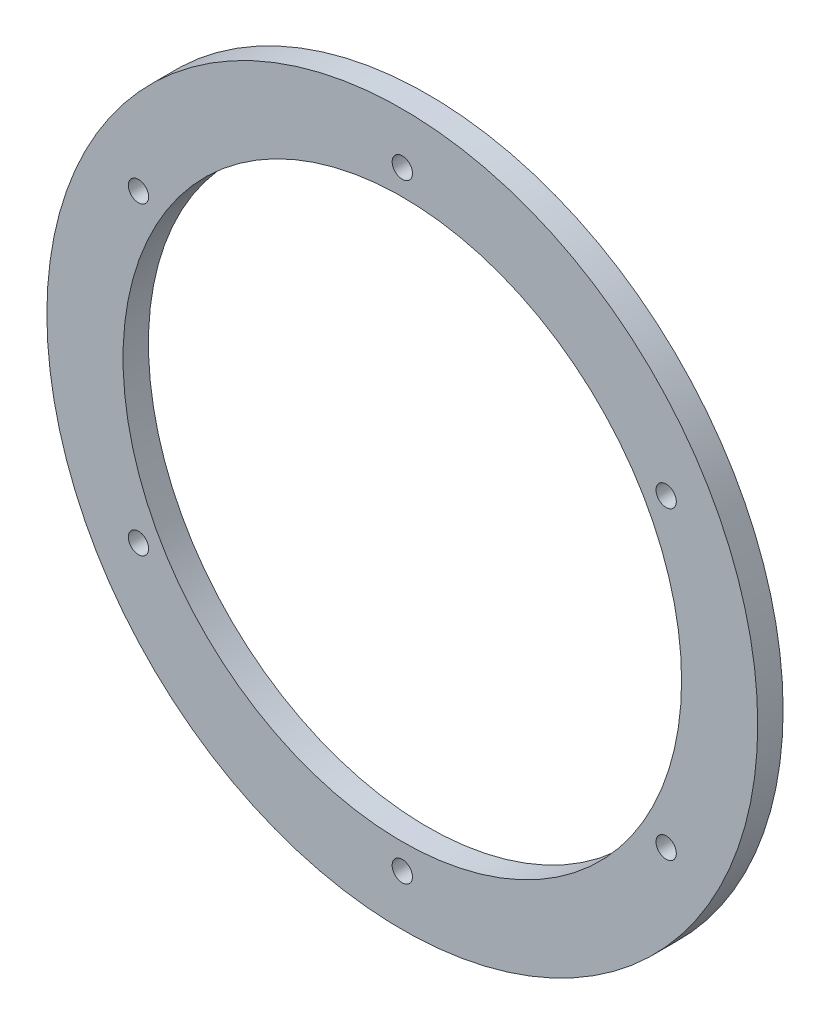
ISO-10303-21;
HEADER;
FILE_DESCRIPTION(('STEP AP214'),'2;1');
FILE_NAME('part.step','',(''),(''),'','','');
FILE_SCHEMA(('AUTOMOTIVE_DESIGN { 1 0 10303 214 1 1 1 1 }'));
ENDSEC;
DATA;
#1=APPLICATION_CONTEXT('core data for automotive mechanical design processes');
#2=APPLICATION_PROTOCOL_DEFINITION('international standard','automotive_design',2000,#1);
#3=PRODUCT_CONTEXT('',#1,'mechanical');
#4=PRODUCT('Part','Part','',(#3));
#5=PRODUCT_RELATED_PRODUCT_CATEGORY('part','',(#4));
#6=PRODUCT_DEFINITION_FORMATION('','',#4);
#7=PRODUCT_DEFINITION_CONTEXT('part definition',#1,'design');
#8=PRODUCT_DEFINITION('design','',#6,#7);
#9=PRODUCT_DEFINITION_SHAPE('','',#8);
#10=(LENGTH_UNIT() NAMED_UNIT(*) SI_UNIT(.MILLI.,.METRE.));
#11=(NAMED_UNIT(*) PLANE_ANGLE_UNIT() SI_UNIT($,.RADIAN.));
#12=(NAMED_UNIT(*) SI_UNIT($,.STERADIAN.) SOLID_ANGLE_UNIT());
#13=UNCERTAINTY_MEASURE_WITH_UNIT(LENGTH_MEASURE(1.E-05),#10,'distance_accuracy_value','');
#14=(GEOMETRIC_REPRESENTATION_CONTEXT(3) GLOBAL_UNCERTAINTY_ASSIGNED_CONTEXT((#13)) GLOBAL_UNIT_ASSIGNED_CONTEXT((#10,
#11,#12)) REPRESENTATION_CONTEXT('',''));
#15=CARTESIAN_POINT('',(0.,0.,0.));
#16=DIRECTION('',(0.,0.,1.));
#17=DIRECTION('',(1.,0.,0.));
#18=AXIS2_PLACEMENT_3D('',#15,#16,#17);
#19=CARTESIAN_POINT('',(0.,0.,0.));
#20=DIRECTION('',(0.,0.,1.));
#21=DIRECTION('',(1.,0.,0.));
#22=AXIS2_PLACEMENT_3D('',#19,#20,#21);
#23=PLANE('',#22);
#24=CARTESIAN_POINT('',(-51.9615242270663,30.,0.));
#25=DIRECTION('',(0.,0.,1.));
#26=DIRECTION('',(1.,0.,0.));
#27=AXIS2_PLACEMENT_3D('',#24,#25,#26);
#28=CIRCLE('',#27,2.);
#29=CARTESIAN_POINT('',(-49.9615242270663,30.,0.));
#30=VERTEX_POINT('',#29);
#31=EDGE_CURVE('E112',#30,#30,#28,.T.);
#32=ORIENTED_EDGE('',*,*,#31,.F.);
#33=EDGE_LOOP('',(#32));
#34=FACE_BOUND('',#33,.T.);
#35=CARTESIAN_POINT('',(-51.9615242270663,-30.,0.));
#36=DIRECTION('',(0.,0.,1.));
#37=DIRECTION('',(1.,0.,0.));
#38=AXIS2_PLACEMENT_3D('',#35,#36,#37);
#39=CIRCLE('',#38,2.);
#40=CARTESIAN_POINT('',(-49.9615242270663,-30.,0.));
#41=VERTEX_POINT('',#40);
#42=EDGE_CURVE('E118',#41,#41,#39,.T.);
#43=ORIENTED_EDGE('',*,*,#42,.F.);
#44=EDGE_LOOP('',(#43));
#45=FACE_BOUND('',#44,.T.);
#46=CARTESIAN_POINT('',(0.,-60.,0.));
#47=DIRECTION('',(0.,0.,1.));
#48=DIRECTION('',(1.,0.,0.));
#49=AXIS2_PLACEMENT_3D('',#46,#47,#48);
#50=CIRCLE('',#49,2.);
#51=CARTESIAN_POINT('',(2.00000000000001,-60.,0.));
#52=VERTEX_POINT('',#51);
#53=EDGE_CURVE('E124',#52,#52,#50,.T.);
#54=ORIENTED_EDGE('',*,*,#53,.F.);
#55=EDGE_LOOP('',(#54));
#56=FACE_BOUND('',#55,.T.);
#57=CARTESIAN_POINT('',(51.9615242270663,-30.,0.));
#58=DIRECTION('',(0.,0.,1.));
#59=DIRECTION('',(1.,0.,0.));
#60=AXIS2_PLACEMENT_3D('',#57,#58,#59);
#61=CIRCLE('',#60,2.);
#62=CARTESIAN_POINT('',(53.9615242270663,-30.,0.));
#63=VERTEX_POINT('',#62);
#64=EDGE_CURVE('E130',#63,#63,#61,.T.);
#65=ORIENTED_EDGE('',*,*,#64,.F.);
#66=EDGE_LOOP('',(#65));
#67=FACE_BOUND('',#66,.T.);
#68=CARTESIAN_POINT('',(51.9615242270663,30.,0.));
#69=DIRECTION('',(0.,0.,1.));
#70=DIRECTION('',(1.,0.,0.));
#71=AXIS2_PLACEMENT_3D('',#68,#69,#70);
#72=CIRCLE('',#71,2.);
#73=CARTESIAN_POINT('',(53.9615242270663,30.,0.));
#74=VERTEX_POINT('',#73);
#75=EDGE_CURVE('E136',#74,#74,#72,.T.);
#76=ORIENTED_EDGE('',*,*,#75,.F.);
#77=EDGE_LOOP('',(#76));
#78=FACE_BOUND('',#77,.T.);
#79=CARTESIAN_POINT('',(0.,60.,0.));
#80=DIRECTION('',(0.,0.,1.));
#81=DIRECTION('',(1.,0.,0.));
#82=AXIS2_PLACEMENT_3D('',#79,#80,#81);
#83=CIRCLE('',#82,2.);
#84=CARTESIAN_POINT('',(2.,60.,0.));
#85=VERTEX_POINT('',#84);
#86=EDGE_CURVE('E142',#85,#85,#83,.T.);
#87=ORIENTED_EDGE('',*,*,#86,.F.);
#88=EDGE_LOOP('',(#87));
#89=FACE_BOUND('',#88,.T.);
#90=CARTESIAN_POINT('',(0.,0.,0.));
#91=DIRECTION('',(0.,0.,1.));
#92=DIRECTION('',(1.,0.,0.));
#93=AXIS2_PLACEMENT_3D('',#90,#91,#92);
#94=CIRCLE('',#93,55.);
#95=CARTESIAN_POINT('',(55.,0.,0.));
#96=VERTEX_POINT('',#95);
#97=EDGE_CURVE('E48',#96,#96,#94,.T.);
#98=ORIENTED_EDGE('',*,*,#97,.F.);
#99=EDGE_LOOP('',(#98));
#100=FACE_BOUND('',#99,.T.);
#101=CARTESIAN_POINT('',(0.,0.,0.));
#102=DIRECTION('',(0.,0.,1.));
#103=DIRECTION('',(1.,0.,0.));
#104=AXIS2_PLACEMENT_3D('',#101,#102,#103);
#105=CIRCLE('',#104,70.);
#106=CARTESIAN_POINT('',(70.,0.,0.));
#107=VERTEX_POINT('',#106);
#108=EDGE_CURVE('E11',#107,#107,#105,.T.);
#109=ORIENTED_EDGE('',*,*,#108,.T.);
#110=EDGE_LOOP('',(#109));
#111=FACE_BOUND('',#110,.T.);
#112=ADVANCED_FACE('F34',(#34,#45,#56,#67,#78,#89,#100,#111),#23,.T.);
#113=CARTESIAN_POINT('',(0.,0.,-5.));
#114=DIRECTION('',(0.,0.,1.));
#115=DIRECTION('',(1.,0.,0.));
#116=AXIS2_PLACEMENT_3D('',#113,#114,#115);
#117=PLANE('',#116);
#118=CARTESIAN_POINT('',(-51.9615242270663,30.,-5.));
#119=DIRECTION('',(0.,0.,1.));
#120=DIRECTION('',(1.,0.,0.));
#121=AXIS2_PLACEMENT_3D('',#118,#119,#120);
#122=CIRCLE('',#121,2.);
#123=CARTESIAN_POINT('',(-49.9615242270663,30.,-5.));
#124=VERTEX_POINT('',#123);
#125=EDGE_CURVE('E115',#124,#124,#122,.T.);
#126=ORIENTED_EDGE('',*,*,#125,.T.);
#127=EDGE_LOOP('',(#126));
#128=FACE_BOUND('',#127,.T.);
#129=CARTESIAN_POINT('',(-51.9615242270663,-30.,-5.));
#130=DIRECTION('',(0.,0.,1.));
#131=DIRECTION('',(1.,0.,0.));
#132=AXIS2_PLACEMENT_3D('',#129,#130,#131);
#133=CIRCLE('',#132,2.);
#134=CARTESIAN_POINT('',(-49.9615242270663,-30.,-5.));
#135=VERTEX_POINT('',#134);
#136=EDGE_CURVE('E121',#135,#135,#133,.T.);
#137=ORIENTED_EDGE('',*,*,#136,.T.);
#138=EDGE_LOOP('',(#137));
#139=FACE_BOUND('',#138,.T.);
#140=CARTESIAN_POINT('',(0.,-60.,-5.));
#141=DIRECTION('',(0.,0.,1.));
#142=DIRECTION('',(1.,0.,0.));
#143=AXIS2_PLACEMENT_3D('',#140,#141,#142);
#144=CIRCLE('',#143,2.);
#145=CARTESIAN_POINT('',(2.00000000000001,-60.,-5.));
#146=VERTEX_POINT('',#145);
#147=EDGE_CURVE('E127',#146,#146,#144,.T.);
#148=ORIENTED_EDGE('',*,*,#147,.T.);
#149=EDGE_LOOP('',(#148));
#150=FACE_BOUND('',#149,.T.);
#151=CARTESIAN_POINT('',(51.9615242270663,-30.,-5.));
#152=DIRECTION('',(0.,0.,1.));
#153=DIRECTION('',(1.,0.,0.));
#154=AXIS2_PLACEMENT_3D('',#151,#152,#153);
#155=CIRCLE('',#154,2.);
#156=CARTESIAN_POINT('',(53.9615242270663,-30.,-5.));
#157=VERTEX_POINT('',#156);
#158=EDGE_CURVE('E133',#157,#157,#155,.T.);
#159=ORIENTED_EDGE('',*,*,#158,.T.);
#160=EDGE_LOOP('',(#159));
#161=FACE_BOUND('',#160,.T.);
#162=CARTESIAN_POINT('',(51.9615242270663,30.,-5.));
#163=DIRECTION('',(0.,0.,1.));
#164=DIRECTION('',(1.,0.,0.));
#165=AXIS2_PLACEMENT_3D('',#162,#163,#164);
#166=CIRCLE('',#165,2.);
#167=CARTESIAN_POINT('',(53.9615242270663,30.,-5.));
#168=VERTEX_POINT('',#167);
#169=EDGE_CURVE('E139',#168,#168,#166,.T.);
#170=ORIENTED_EDGE('',*,*,#169,.T.);
#171=EDGE_LOOP('',(#170));
#172=FACE_BOUND('',#171,.T.);
#173=CARTESIAN_POINT('',(0.,60.,-5.));
#174=DIRECTION('',(0.,0.,1.));
#175=DIRECTION('',(1.,0.,0.));
#176=AXIS2_PLACEMENT_3D('',#173,#174,#175);
#177=CIRCLE('',#176,2.);
#178=CARTESIAN_POINT('',(2.,60.,-5.));
#179=VERTEX_POINT('',#178);
#180=EDGE_CURVE('E109',#179,#179,#177,.T.);
#181=ORIENTED_EDGE('',*,*,#180,.T.);
#182=EDGE_LOOP('',(#181));
#183=FACE_BOUND('',#182,.T.);
#184=CARTESIAN_POINT('',(0.,0.,-5.));
#185=DIRECTION('',(0.,0.,1.));
#186=DIRECTION('',(1.,0.,0.));
#187=AXIS2_PLACEMENT_3D('',#184,#185,#186);
#188=CIRCLE('',#187,55.);
#189=CARTESIAN_POINT('',(55.,0.,-5.));
#190=VERTEX_POINT('',#189);
#191=EDGE_CURVE('E45',#190,#190,#188,.T.);
#192=ORIENTED_EDGE('',*,*,#191,.T.);
#193=EDGE_LOOP('',(#192));
#194=FACE_BOUND('',#193,.T.);
#195=CARTESIAN_POINT('',(0.,0.,-5.));
#196=DIRECTION('',(0.,0.,1.));
#197=DIRECTION('',(1.,0.,0.));
#198=AXIS2_PLACEMENT_3D('',#195,#196,#197);
#199=CIRCLE('',#198,70.);
#200=CARTESIAN_POINT('',(70.,0.,-5.));
#201=VERTEX_POINT('',#200);
#202=EDGE_CURVE('E38',#201,#201,#199,.T.);
#203=ORIENTED_EDGE('',*,*,#202,.F.);
#204=EDGE_LOOP('',(#203));
#205=FACE_BOUND('',#204,.T.);
#206=ADVANCED_FACE('F148',(#128,#139,#150,#161,#172,#183,#194,#205),#117,.F.);
#207=CARTESIAN_POINT('',(0.,0.,0.));
#208=DIRECTION('',(0.,0.,-1.));
#209=DIRECTION('',(-1.,0.,0.));
#210=AXIS2_PLACEMENT_3D('',#207,#208,#209);
#211=CYLINDRICAL_SURFACE('',#210,70.);
#212=ORIENTED_EDGE('',*,*,#108,.F.);
#213=EDGE_LOOP('',(#212));
#214=FACE_BOUND('',#213,.T.);
#215=ORIENTED_EDGE('',*,*,#202,.T.);
#216=EDGE_LOOP('',(#215));
#217=FACE_BOUND('',#216,.T.);
#218=ADVANCED_FACE('F36',(#214,#217),#211,.T.);
#219=CARTESIAN_POINT('',(0.,0.,-5.));
#220=DIRECTION('',(0.,0.,1.));
#221=DIRECTION('',(1.,0.,0.));
#222=AXIS2_PLACEMENT_3D('',#219,#220,#221);
#223=CYLINDRICAL_SURFACE('',#222,55.);
#224=ORIENTED_EDGE('',*,*,#191,.F.);
#225=EDGE_LOOP('',(#224));
#226=FACE_BOUND('',#225,.T.);
#227=ORIENTED_EDGE('',*,*,#97,.T.);
#228=EDGE_LOOP('',(#227));
#229=FACE_BOUND('',#228,.T.);
#230=ADVANCED_FACE('F155',(#226,#229),#223,.F.);
#231=CARTESIAN_POINT('',(0.,60.,-5.));
#232=DIRECTION('',(0.,0.,1.));
#233=DIRECTION('',(1.,0.,0.));
#234=AXIS2_PLACEMENT_3D('',#231,#232,#233);
#235=CYLINDRICAL_SURFACE('',#234,2.);
#236=ORIENTED_EDGE('',*,*,#180,.F.);
#237=EDGE_LOOP('',(#236));
#238=FACE_BOUND('',#237,.T.);
#239=ORIENTED_EDGE('',*,*,#86,.T.);
#240=EDGE_LOOP('',(#239));
#241=FACE_BOUND('',#240,.T.);
#242=ADVANCED_FACE('F151',(#238,#241),#235,.F.);
#243=CARTESIAN_POINT('',(51.9615242270663,30.,-5.));
#244=DIRECTION('',(0.,0.,1.));
#245=DIRECTION('',(1.,0.,0.));
#246=AXIS2_PLACEMENT_3D('',#243,#244,#245);
#247=CYLINDRICAL_SURFACE('',#246,2.);
#248=ORIENTED_EDGE('',*,*,#169,.F.);
#249=EDGE_LOOP('',(#248));
#250=FACE_BOUND('',#249,.T.);
#251=ORIENTED_EDGE('',*,*,#75,.T.);
#252=EDGE_LOOP('',(#251));
#253=FACE_BOUND('',#252,.T.);
#254=ADVANCED_FACE('F154',(#250,#253),#247,.F.);
#255=CARTESIAN_POINT('',(51.9615242270663,-30.,-5.));
#256=DIRECTION('',(0.,0.,1.));
#257=DIRECTION('',(1.,0.,0.));
#258=AXIS2_PLACEMENT_3D('',#255,#256,#257);
#259=CYLINDRICAL_SURFACE('',#258,2.);
#260=ORIENTED_EDGE('',*,*,#158,.F.);
#261=EDGE_LOOP('',(#260));
#262=FACE_BOUND('',#261,.T.);
#263=ORIENTED_EDGE('',*,*,#64,.T.);
#264=EDGE_LOOP('',(#263));
#265=FACE_BOUND('',#264,.T.);
#266=ADVANCED_FACE('F192',(#262,#265),#259,.F.);
#267=CARTESIAN_POINT('',(0.,-60.,-5.));
#268=DIRECTION('',(0.,0.,1.));
#269=DIRECTION('',(1.,0.,0.));
#270=AXIS2_PLACEMENT_3D('',#267,#268,#269);
#271=CYLINDRICAL_SURFACE('',#270,2.);
#272=ORIENTED_EDGE('',*,*,#147,.F.);
#273=EDGE_LOOP('',(#272));
#274=FACE_BOUND('',#273,.T.);
#275=ORIENTED_EDGE('',*,*,#53,.T.);
#276=EDGE_LOOP('',(#275));
#277=FACE_BOUND('',#276,.T.);
#278=ADVANCED_FACE('F199',(#274,#277),#271,.F.);
#279=CARTESIAN_POINT('',(-51.9615242270663,-30.,-5.));
#280=DIRECTION('',(0.,0.,1.));
#281=DIRECTION('',(1.,0.,0.));
#282=AXIS2_PLACEMENT_3D('',#279,#280,#281);
#283=CYLINDRICAL_SURFACE('',#282,2.);
#284=ORIENTED_EDGE('',*,*,#136,.F.);
#285=EDGE_LOOP('',(#284));
#286=FACE_BOUND('',#285,.T.);
#287=ORIENTED_EDGE('',*,*,#42,.T.);
#288=EDGE_LOOP('',(#287));
#289=FACE_BOUND('',#288,.T.);
#290=ADVANCED_FACE('F204',(#286,#289),#283,.F.);
#291=CARTESIAN_POINT('',(-51.9615242270663,30.,-5.));
#292=DIRECTION('',(0.,0.,1.));
#293=DIRECTION('',(1.,0.,0.));
#294=AXIS2_PLACEMENT_3D('',#291,#292,#293);
#295=CYLINDRICAL_SURFACE('',#294,2.);
#296=ORIENTED_EDGE('',*,*,#125,.F.);
#297=EDGE_LOOP('',(#296));
#298=FACE_BOUND('',#297,.T.);
#299=ORIENTED_EDGE('',*,*,#31,.T.);
#300=EDGE_LOOP('',(#299));
#301=FACE_BOUND('',#300,.T.);
#302=ADVANCED_FACE('F174',(#298,#301),#295,.F.);
#303=CLOSED_SHELL('',(#112,#206,#218,#230,#242,#254,#266,#278,#290,#302));
#304=MANIFOLD_SOLID_BREP('B2',#303);
#305=ADVANCED_BREP_SHAPE_REPRESENTATION('',(#18,#304),#14);
#306=SHAPE_DEFINITION_REPRESENTATION(#9,#305);
ENDSEC;
END-ISO-10303-21;
